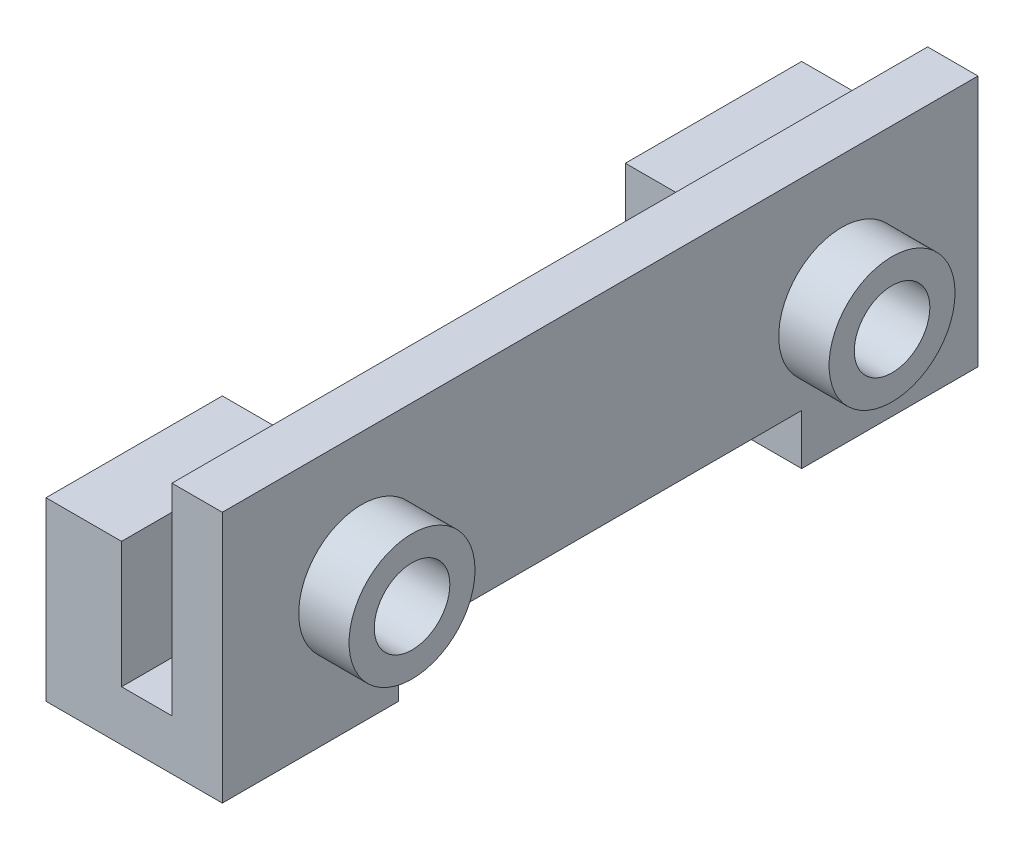
ISO-10303-21;
HEADER;
FILE_DESCRIPTION(('STEP AP214'),'2;1');
FILE_NAME('part.step','',(''),(''),'','','');
FILE_SCHEMA(('AUTOMOTIVE_DESIGN { 1 0 10303 214 1 1 1 1 }'));
ENDSEC;
DATA;
#1=APPLICATION_CONTEXT('core data for automotive mechanical design processes');
#2=APPLICATION_PROTOCOL_DEFINITION('international standard','automotive_design',2000,#1);
#3=PRODUCT_CONTEXT('',#1,'mechanical');
#4=PRODUCT('Part','Part','',(#3));
#5=PRODUCT_RELATED_PRODUCT_CATEGORY('part','',(#4));
#6=PRODUCT_DEFINITION_FORMATION('','',#4);
#7=PRODUCT_DEFINITION_CONTEXT('part definition',#1,'design');
#8=PRODUCT_DEFINITION('design','',#6,#7);
#9=PRODUCT_DEFINITION_SHAPE('','',#8);
#10=(LENGTH_UNIT() NAMED_UNIT(*) SI_UNIT(.MILLI.,.METRE.));
#11=(NAMED_UNIT(*) PLANE_ANGLE_UNIT() SI_UNIT($,.RADIAN.));
#12=(NAMED_UNIT(*) SI_UNIT($,.STERADIAN.) SOLID_ANGLE_UNIT());
#13=UNCERTAINTY_MEASURE_WITH_UNIT(LENGTH_MEASURE(1.E-05),#10,'distance_accuracy_value','');
#14=(GEOMETRIC_REPRESENTATION_CONTEXT(3) GLOBAL_UNCERTAINTY_ASSIGNED_CONTEXT((#13)) GLOBAL_UNIT_ASSIGNED_CONTEXT((#10,
#11,#12)) REPRESENTATION_CONTEXT('',''));
#15=CARTESIAN_POINT('',(0.,0.,0.));
#16=DIRECTION('',(0.,0.,1.));
#17=DIRECTION('',(1.,0.,0.));
#18=AXIS2_PLACEMENT_3D('',#15,#16,#17);
#19=CARTESIAN_POINT('',(-5.,-3.,-15.));
#20=DIRECTION('',(0.,-1.,0.));
#21=DIRECTION('',(0.,0.,-1.));
#22=AXIS2_PLACEMENT_3D('',#19,#20,#21);
#23=PLANE('',#22);
#24=DIRECTION('',(0.,0.,-1.));
#25=VECTOR('',#24,1.);
#26=CARTESIAN_POINT('',(-2.,-3.,-15.));
#27=LINE('',#26,#25);
#28=CARTESIAN_POINT('',(-2.,-3.,-8.));
#29=VERTEX_POINT('',#28);
#30=CARTESIAN_POINT('',(-2.,-3.,-15.));
#31=VERTEX_POINT('',#30);
#32=EDGE_CURVE('E183',#29,#31,#27,.T.);
#33=ORIENTED_EDGE('',*,*,#32,.F.);
#34=DIRECTION('',(1.,0.,0.));
#35=VECTOR('',#34,1.);
#36=CARTESIAN_POINT('',(-5.,-3.,-8.));
#37=LINE('',#36,#35);
#38=CARTESIAN_POINT('',(0.,-3.,-8.));
#39=VERTEX_POINT('',#38);
#40=EDGE_CURVE('E213',#29,#39,#37,.T.);
#41=ORIENTED_EDGE('',*,*,#40,.T.);
#42=DIRECTION('',(0.,0.,-1.));
#43=VECTOR('',#42,1.);
#44=CARTESIAN_POINT('',(0.,-3.,-15.));
#45=LINE('',#44,#43);
#46=CARTESIAN_POINT('',(0.,-3.,-15.));
#47=VERTEX_POINT('',#46);
#48=EDGE_CURVE('E200',#39,#47,#45,.T.);
#49=ORIENTED_EDGE('',*,*,#48,.T.);
#50=DIRECTION('',(1.,0.,0.));
#51=VECTOR('',#50,1.);
#52=CARTESIAN_POINT('',(-5.,-3.,-15.));
#53=LINE('',#52,#51);
#54=EDGE_CURVE('E209',#31,#47,#53,.T.);
#55=ORIENTED_EDGE('',*,*,#54,.F.);
#56=EDGE_LOOP('',(#33,#41,#49,#55));
#57=FACE_BOUND('',#56,.T.);
#58=ADVANCED_FACE('F33',(#57),#23,.F.);
#59=CARTESIAN_POINT('',(0.,0.,0.));
#60=DIRECTION('',(1.,0.,0.));
#61=DIRECTION('',(0.,0.,-1.));
#62=AXIS2_PLACEMENT_3D('',#59,#60,#61);
#63=PLANE('',#62);
#64=CARTESIAN_POINT('',(0.,0.,-9.58862249274262));
#65=DIRECTION('',(1.,0.,0.));
#66=DIRECTION('',(0.,0.,-1.));
#67=AXIS2_PLACEMENT_3D('',#64,#65,#66);
#68=CIRCLE('',#67,1.5);
#69=CARTESIAN_POINT('',(0.,0.,-11.0886224927426));
#70=VERTEX_POINT('',#69);
#71=EDGE_CURVE('E237',#70,#70,#68,.T.);
#72=ORIENTED_EDGE('',*,*,#71,.T.);
#73=EDGE_LOOP('',(#72));
#74=FACE_BOUND('',#73,.T.);
#75=CARTESIAN_POINT('',(0.,0.,9.46784622414043));
#76=DIRECTION('',(1.,0.,0.));
#77=DIRECTION('',(0.,0.,-1.));
#78=AXIS2_PLACEMENT_3D('',#75,#76,#77);
#79=CIRCLE('',#78,1.5);
#80=CARTESIAN_POINT('',(0.,0.,7.96784622414043));
#81=VERTEX_POINT('',#80);
#82=EDGE_CURVE('E243',#81,#81,#79,.T.);
#83=ORIENTED_EDGE('',*,*,#82,.T.);
#84=EDGE_LOOP('',(#83));
#85=FACE_BOUND('',#84,.T.);
#86=DIRECTION('',(0.,0.,-1.));
#87=VECTOR('',#86,1.);
#88=CARTESIAN_POINT('',(0.,-3.,8.));
#89=LINE('',#88,#87);
#90=CARTESIAN_POINT('',(0.,-3.,8.));
#91=VERTEX_POINT('',#90);
#92=EDGE_CURVE('E230',#91,#39,#89,.T.);
#93=ORIENTED_EDGE('',*,*,#92,.F.);
#94=DIRECTION('',(0.,0.,1.));
#95=VECTOR('',#94,1.);
#96=CARTESIAN_POINT('',(0.,-3.,15.));
#97=LINE('',#96,#95);
#98=CARTESIAN_POINT('',(0.,-3.,15.));
#99=VERTEX_POINT('',#98);
#100=EDGE_CURVE('E152',#91,#99,#97,.T.);
#101=ORIENTED_EDGE('',*,*,#100,.T.);
#102=DIRECTION('',(0.,-1.,0.));
#103=VECTOR('',#102,1.);
#104=CARTESIAN_POINT('',(0.,5.,15.));
#105=LINE('',#104,#103);
#106=CARTESIAN_POINT('',(0.,5.,15.));
#107=VERTEX_POINT('',#106);
#108=EDGE_CURVE('E265',#107,#99,#105,.T.);
#109=ORIENTED_EDGE('',*,*,#108,.F.);
#110=DIRECTION('',(0.,0.,1.));
#111=VECTOR('',#110,1.);
#112=CARTESIAN_POINT('',(0.,5.,15.));
#113=LINE('',#112,#111);
#114=CARTESIAN_POINT('',(0.,5.,-15.));
#115=VERTEX_POINT('',#114);
#116=EDGE_CURVE('E275',#115,#107,#113,.T.);
#117=ORIENTED_EDGE('',*,*,#116,.F.);
#118=DIRECTION('',(0.,1.,0.));
#119=VECTOR('',#118,1.);
#120=CARTESIAN_POINT('',(0.,5.,-15.));
#121=LINE('',#120,#119);
#122=EDGE_CURVE('E258',#47,#115,#121,.T.);
#123=ORIENTED_EDGE('',*,*,#122,.F.);
#124=ORIENTED_EDGE('',*,*,#48,.F.);
#125=EDGE_LOOP('',(#93,#101,#109,#117,#123,#124));
#126=FACE_BOUND('',#125,.T.);
#127=ADVANCED_FACE('F288',(#74,#85,#126),#63,.F.);
#128=CARTESIAN_POINT('',(2.,-5.,15.));
#129=DIRECTION('',(0.,1.,0.));
#130=DIRECTION('',(0.,0.,1.));
#131=AXIS2_PLACEMENT_3D('',#128,#129,#130);
#132=PLANE('',#131);
#133=DIRECTION('',(-1.,0.,0.));
#134=VECTOR('',#133,1.);
#135=CARTESIAN_POINT('',(0.,-5.,-8.));
#136=LINE('',#135,#134);
#137=CARTESIAN_POINT('',(2.,-5.,-8.));
#138=VERTEX_POINT('',#137);
#139=CARTESIAN_POINT('',(-5.,-5.,-8.));
#140=VERTEX_POINT('',#139);
#141=EDGE_CURVE('E215',#138,#140,#136,.T.);
#142=ORIENTED_EDGE('',*,*,#141,.T.);
#143=DIRECTION('',(0.,0.,1.));
#144=VECTOR('',#143,1.);
#145=CARTESIAN_POINT('',(-5.,-5.,-15.));
#146=LINE('',#145,#144);
#147=CARTESIAN_POINT('',(-5.,-5.,-15.));
#148=VERTEX_POINT('',#147);
#149=EDGE_CURVE('E204',#148,#140,#146,.T.);
#150=ORIENTED_EDGE('',*,*,#149,.F.);
#151=DIRECTION('',(-1.,0.,0.));
#152=VECTOR('',#151,1.);
#153=CARTESIAN_POINT('',(2.,-5.,-15.));
#154=LINE('',#153,#152);
#155=CARTESIAN_POINT('',(2.,-5.,-15.));
#156=VERTEX_POINT('',#155);
#157=EDGE_CURVE('E273',#156,#148,#154,.T.);
#158=ORIENTED_EDGE('',*,*,#157,.F.);
#159=DIRECTION('',(0.,0.,-1.));
#160=VECTOR('',#159,1.);
#161=CARTESIAN_POINT('',(2.,-5.,15.));
#162=LINE('',#161,#160);
#163=EDGE_CURVE('E269',#138,#156,#162,.T.);
#164=ORIENTED_EDGE('',*,*,#163,.F.);
#165=EDGE_LOOP('',(#142,#150,#158,#164));
#166=FACE_BOUND('',#165,.T.);
#167=ADVANCED_FACE('F323',(#166),#132,.F.);
#168=CARTESIAN_POINT('',(2.,0.,0.));
#169=DIRECTION('',(1.,0.,0.));
#170=DIRECTION('',(0.,0.,-1.));
#171=AXIS2_PLACEMENT_3D('',#168,#169,#170);
#172=PLANE('',#171);
#173=CARTESIAN_POINT('',(2.,0.,9.46784622414043));
#174=DIRECTION('',(1.,0.,0.));
#175=DIRECTION('',(0.,0.,-1.));
#176=AXIS2_PLACEMENT_3D('',#173,#174,#175);
#177=CIRCLE('',#176,2.5);
#178=CARTESIAN_POINT('',(2.,0.,6.96784622414043));
#179=VERTEX_POINT('',#178);
#180=EDGE_CURVE('E249',#179,#179,#177,.T.);
#181=ORIENTED_EDGE('',*,*,#180,.F.);
#182=EDGE_LOOP('',(#181));
#183=FACE_BOUND('',#182,.T.);
#184=CARTESIAN_POINT('',(2.,0.,-9.58862249274262));
#185=DIRECTION('',(1.,0.,0.));
#186=DIRECTION('',(0.,0.,-1.));
#187=AXIS2_PLACEMENT_3D('',#184,#185,#186);
#188=CIRCLE('',#187,2.5);
#189=CARTESIAN_POINT('',(2.,0.,-12.0886224927426));
#190=VERTEX_POINT('',#189);
#191=EDGE_CURVE('E252',#190,#190,#188,.T.);
#192=ORIENTED_EDGE('',*,*,#191,.F.);
#193=EDGE_LOOP('',(#192));
#194=FACE_BOUND('',#193,.T.);
#195=DIRECTION('',(0.,0.,1.));
#196=VECTOR('',#195,1.);
#197=CARTESIAN_POINT('',(2.,-3.,8.));
#198=LINE('',#197,#196);
#199=CARTESIAN_POINT('',(2.,-3.,-8.));
#200=VERTEX_POINT('',#199);
#201=CARTESIAN_POINT('',(2.,-3.,8.));
#202=VERTEX_POINT('',#201);
#203=EDGE_CURVE('E224',#200,#202,#198,.T.);
#204=ORIENTED_EDGE('',*,*,#203,.F.);
#205=DIRECTION('',(0.,-1.,0.));
#206=VECTOR('',#205,1.);
#207=CARTESIAN_POINT('',(2.,-3.,-8.));
#208=LINE('',#207,#206);
#209=EDGE_CURVE('E219',#200,#138,#208,.T.);
#210=ORIENTED_EDGE('',*,*,#209,.T.);
#211=ORIENTED_EDGE('',*,*,#163,.T.);
#212=DIRECTION('',(0.,1.,0.));
#213=VECTOR('',#212,1.);
#214=CARTESIAN_POINT('',(2.,5.,-15.));
#215=LINE('',#214,#213);
#216=CARTESIAN_POINT('',(2.,5.,-15.));
#217=VERTEX_POINT('',#216);
#218=EDGE_CURVE('E261',#156,#217,#215,.T.);
#219=ORIENTED_EDGE('',*,*,#218,.T.);
#220=DIRECTION('',(0.,0.,1.));
#221=VECTOR('',#220,1.);
#222=CARTESIAN_POINT('',(2.,5.,15.));
#223=LINE('',#222,#221);
#224=CARTESIAN_POINT('',(2.,5.,15.));
#225=VERTEX_POINT('',#224);
#226=EDGE_CURVE('E264',#217,#225,#223,.T.);
#227=ORIENTED_EDGE('',*,*,#226,.T.);
#228=DIRECTION('',(0.,-1.,0.));
#229=VECTOR('',#228,1.);
#230=CARTESIAN_POINT('',(2.,5.,15.));
#231=LINE('',#230,#229);
#232=CARTESIAN_POINT('',(2.,-5.,15.));
#233=VERTEX_POINT('',#232);
#234=EDGE_CURVE('E267',#225,#233,#231,.T.);
#235=ORIENTED_EDGE('',*,*,#234,.T.);
#236=CARTESIAN_POINT('',(2.,-5.,8.));
#237=VERTEX_POINT('',#236);
#238=EDGE_CURVE('E270',#233,#237,#162,.T.);
#239=ORIENTED_EDGE('',*,*,#238,.T.);
#240=DIRECTION('',(0.,-1.,0.));
#241=VECTOR('',#240,1.);
#242=CARTESIAN_POINT('',(2.,-3.,8.));
#243=LINE('',#242,#241);
#244=EDGE_CURVE('E233',#202,#237,#243,.T.);
#245=ORIENTED_EDGE('',*,*,#244,.F.);
#246=EDGE_LOOP('',(#204,#210,#211,#219,#227,#235,#239,#245));
#247=FACE_BOUND('',#246,.T.);
#248=ADVANCED_FACE('F302',(#183,#194,#247),#172,.T.);
#249=CARTESIAN_POINT('',(2.,5.,-15.));
#250=DIRECTION('',(0.,0.,1.));
#251=DIRECTION('',(1.,0.,0.));
#252=AXIS2_PLACEMENT_3D('',#249,#250,#251);
#253=PLANE('',#252);
#254=ORIENTED_EDGE('',*,*,#157,.T.);
#255=DIRECTION('',(0.,-1.,0.));
#256=VECTOR('',#255,1.);
#257=CARTESIAN_POINT('',(-5.,-5.,-15.));
#258=LINE('',#257,#256);
#259=CARTESIAN_POINT('',(-5.,2.,-15.));
#260=VERTEX_POINT('',#259);
#261=EDGE_CURVE('E201',#260,#148,#258,.T.);
#262=ORIENTED_EDGE('',*,*,#261,.F.);
#263=DIRECTION('',(-1.,0.,0.));
#264=VECTOR('',#263,1.);
#265=CARTESIAN_POINT('',(-5.,2.,-15.));
#266=LINE('',#265,#264);
#267=CARTESIAN_POINT('',(-2.,2.,-15.));
#268=VERTEX_POINT('',#267);
#269=EDGE_CURVE('E191',#268,#260,#266,.T.);
#270=ORIENTED_EDGE('',*,*,#269,.F.);
#271=DIRECTION('',(0.,-1.,0.));
#272=VECTOR('',#271,1.);
#273=CARTESIAN_POINT('',(-2.,2.,-15.));
#274=LINE('',#273,#272);
#275=EDGE_CURVE('E194',#268,#31,#274,.T.);
#276=ORIENTED_EDGE('',*,*,#275,.T.);
#277=ORIENTED_EDGE('',*,*,#54,.T.);
#278=ORIENTED_EDGE('',*,*,#122,.T.);
#279=DIRECTION('',(-1.,0.,0.));
#280=VECTOR('',#279,1.);
#281=CARTESIAN_POINT('',(2.,5.,-15.));
#282=LINE('',#281,#280);
#283=EDGE_CURVE('E11',#217,#115,#282,.T.);
#284=ORIENTED_EDGE('',*,*,#283,.F.);
#285=ORIENTED_EDGE('',*,*,#218,.F.);
#286=EDGE_LOOP('',(#254,#262,#270,#276,#277,#278,#284,#285));
#287=FACE_BOUND('',#286,.T.);
#288=ADVANCED_FACE('F35',(#287),#253,.F.);
#289=CARTESIAN_POINT('',(2.,5.,15.));
#290=DIRECTION('',(0.,-1.,0.));
#291=DIRECTION('',(0.,0.,-1.));
#292=AXIS2_PLACEMENT_3D('',#289,#290,#291);
#293=PLANE('',#292);
#294=ORIENTED_EDGE('',*,*,#116,.T.);
#295=DIRECTION('',(-1.,0.,0.));
#296=VECTOR('',#295,1.);
#297=CARTESIAN_POINT('',(2.,5.,15.));
#298=LINE('',#297,#296);
#299=EDGE_CURVE('E41',#225,#107,#298,.T.);
#300=ORIENTED_EDGE('',*,*,#299,.F.);
#301=ORIENTED_EDGE('',*,*,#226,.F.);
#302=ORIENTED_EDGE('',*,*,#283,.T.);
#303=EDGE_LOOP('',(#294,#300,#301,#302));
#304=FACE_BOUND('',#303,.T.);
#305=ADVANCED_FACE('F305',(#304),#293,.F.);
#306=CARTESIAN_POINT('',(2.,5.,15.));
#307=DIRECTION('',(0.,0.,-1.));
#308=DIRECTION('',(-1.,0.,0.));
#309=AXIS2_PLACEMENT_3D('',#306,#307,#308);
#310=PLANE('',#309);
#311=ORIENTED_EDGE('',*,*,#108,.T.);
#312=DIRECTION('',(1.,0.,0.));
#313=VECTOR('',#312,1.);
#314=CARTESIAN_POINT('',(-5.,-3.,15.));
#315=LINE('',#314,#313);
#316=CARTESIAN_POINT('',(-2.,-3.,15.));
#317=VERTEX_POINT('',#316);
#318=EDGE_CURVE('E181',#317,#99,#315,.T.);
#319=ORIENTED_EDGE('',*,*,#318,.F.);
#320=DIRECTION('',(0.,-1.,0.));
#321=VECTOR('',#320,1.);
#322=CARTESIAN_POINT('',(-2.,2.,15.));
#323=LINE('',#322,#321);
#324=CARTESIAN_POINT('',(-2.,2.,15.));
#325=VERTEX_POINT('',#324);
#326=EDGE_CURVE('E166',#325,#317,#323,.T.);
#327=ORIENTED_EDGE('',*,*,#326,.F.);
#328=DIRECTION('',(-1.,0.,0.));
#329=VECTOR('',#328,1.);
#330=CARTESIAN_POINT('',(-5.,2.,15.));
#331=LINE('',#330,#329);
#332=CARTESIAN_POINT('',(-5.,2.,15.));
#333=VERTEX_POINT('',#332);
#334=EDGE_CURVE('E158',#325,#333,#331,.T.);
#335=ORIENTED_EDGE('',*,*,#334,.T.);
#336=DIRECTION('',(0.,-1.,0.));
#337=VECTOR('',#336,1.);
#338=CARTESIAN_POINT('',(-5.,-5.,15.));
#339=LINE('',#338,#337);
#340=CARTESIAN_POINT('',(-5.,-5.,15.));
#341=VERTEX_POINT('',#340);
#342=EDGE_CURVE('E140',#333,#341,#339,.T.);
#343=ORIENTED_EDGE('',*,*,#342,.T.);
#344=DIRECTION('',(-1.,0.,0.));
#345=VECTOR('',#344,1.);
#346=CARTESIAN_POINT('',(2.,-5.,15.));
#347=LINE('',#346,#345);
#348=EDGE_CURVE('E279',#233,#341,#347,.T.);
#349=ORIENTED_EDGE('',*,*,#348,.F.);
#350=ORIENTED_EDGE('',*,*,#234,.F.);
#351=ORIENTED_EDGE('',*,*,#299,.T.);
#352=EDGE_LOOP('',(#311,#319,#327,#335,#343,#349,#350,#351));
#353=FACE_BOUND('',#352,.T.);
#354=ADVANCED_FACE('F164',(#353),#310,.F.);
#355=ORIENTED_EDGE('',*,*,#348,.T.);
#356=DIRECTION('',(0.,0.,-1.));
#357=VECTOR('',#356,1.);
#358=CARTESIAN_POINT('',(-5.,-5.,15.));
#359=LINE('',#358,#357);
#360=CARTESIAN_POINT('',(-5.,-5.,8.));
#361=VERTEX_POINT('',#360);
#362=EDGE_CURVE('E147',#341,#361,#359,.T.);
#363=ORIENTED_EDGE('',*,*,#362,.T.);
#364=DIRECTION('',(-1.,0.,0.));
#365=VECTOR('',#364,1.);
#366=CARTESIAN_POINT('',(0.,-5.,8.));
#367=LINE('',#366,#365);
#368=EDGE_CURVE('E223',#237,#361,#367,.T.);
#369=ORIENTED_EDGE('',*,*,#368,.F.);
#370=ORIENTED_EDGE('',*,*,#238,.F.);
#371=EDGE_LOOP('',(#355,#363,#369,#370));
#372=FACE_BOUND('',#371,.T.);
#373=ADVANCED_FACE('F298',(#372),#132,.F.);
#374=CARTESIAN_POINT('',(4.,0.,-9.58862249274262));
#375=DIRECTION('',(-1.,0.,0.));
#376=DIRECTION('',(0.,0.,1.));
#377=AXIS2_PLACEMENT_3D('',#374,#375,#376);
#378=CYLINDRICAL_SURFACE('',#377,2.5);
#379=CARTESIAN_POINT('',(4.,0.,-9.58862249274262));
#380=DIRECTION('',(1.,0.,0.));
#381=DIRECTION('',(0.,0.,-1.));
#382=AXIS2_PLACEMENT_3D('',#379,#380,#381);
#383=CIRCLE('',#382,2.5);
#384=CARTESIAN_POINT('',(4.,0.,-12.0886224927426));
#385=VERTEX_POINT('',#384);
#386=EDGE_CURVE('E255',#385,#385,#383,.T.);
#387=ORIENTED_EDGE('',*,*,#386,.F.);
#388=EDGE_LOOP('',(#387));
#389=FACE_BOUND('',#388,.T.);
#390=ORIENTED_EDGE('',*,*,#191,.T.);
#391=EDGE_LOOP('',(#390));
#392=FACE_BOUND('',#391,.T.);
#393=ADVANCED_FACE('F374',(#389,#392),#378,.T.);
#394=CARTESIAN_POINT('',(4.,0.,-9.58862249274262));
#395=DIRECTION('',(1.,0.,0.));
#396=DIRECTION('',(0.,0.,-1.));
#397=AXIS2_PLACEMENT_3D('',#394,#395,#396);
#398=PLANE('',#397);
#399=CARTESIAN_POINT('',(4.,0.,-9.58862249274262));
#400=DIRECTION('',(1.,0.,0.));
#401=DIRECTION('',(0.,0.,-1.));
#402=AXIS2_PLACEMENT_3D('',#399,#400,#401);
#403=CIRCLE('',#402,1.5);
#404=CARTESIAN_POINT('',(4.,0.,-11.0886224927426));
#405=VERTEX_POINT('',#404);
#406=EDGE_CURVE('E236',#405,#405,#403,.T.);
#407=ORIENTED_EDGE('',*,*,#406,.F.);
#408=EDGE_LOOP('',(#407));
#409=FACE_BOUND('',#408,.T.);
#410=ORIENTED_EDGE('',*,*,#386,.T.);
#411=EDGE_LOOP('',(#410));
#412=FACE_BOUND('',#411,.T.);
#413=ADVANCED_FACE('F367',(#409,#412),#398,.T.);
#414=CARTESIAN_POINT('',(4.,0.,9.46784622414043));
#415=DIRECTION('',(-1.,0.,0.));
#416=DIRECTION('',(0.,0.,1.));
#417=AXIS2_PLACEMENT_3D('',#414,#415,#416);
#418=CYLINDRICAL_SURFACE('',#417,2.5);
#419=CARTESIAN_POINT('',(4.,0.,9.46784622414043));
#420=DIRECTION('',(1.,0.,0.));
#421=DIRECTION('',(0.,0.,-1.));
#422=AXIS2_PLACEMENT_3D('',#419,#420,#421);
#423=CIRCLE('',#422,2.5);
#424=CARTESIAN_POINT('',(4.,0.,6.96784622414043));
#425=VERTEX_POINT('',#424);
#426=EDGE_CURVE('E246',#425,#425,#423,.T.);
#427=ORIENTED_EDGE('',*,*,#426,.F.);
#428=EDGE_LOOP('',(#427));
#429=FACE_BOUND('',#428,.T.);
#430=ORIENTED_EDGE('',*,*,#180,.T.);
#431=EDGE_LOOP('',(#430));
#432=FACE_BOUND('',#431,.T.);
#433=ADVANCED_FACE('F364',(#429,#432),#418,.T.);
#434=CARTESIAN_POINT('',(4.,0.,9.46784622414043));
#435=DIRECTION('',(1.,0.,0.));
#436=DIRECTION('',(0.,0.,-1.));
#437=AXIS2_PLACEMENT_3D('',#434,#435,#436);
#438=PLANE('',#437);
#439=CARTESIAN_POINT('',(4.,0.,9.46784622414043));
#440=DIRECTION('',(1.,0.,0.));
#441=DIRECTION('',(0.,0.,-1.));
#442=AXIS2_PLACEMENT_3D('',#439,#440,#441);
#443=CIRCLE('',#442,1.5);
#444=CARTESIAN_POINT('',(4.,0.,7.96784622414043));
#445=VERTEX_POINT('',#444);
#446=EDGE_CURVE('E240',#445,#445,#443,.T.);
#447=ORIENTED_EDGE('',*,*,#446,.F.);
#448=EDGE_LOOP('',(#447));
#449=FACE_BOUND('',#448,.T.);
#450=ORIENTED_EDGE('',*,*,#426,.T.);
#451=EDGE_LOOP('',(#450));
#452=FACE_BOUND('',#451,.T.);
#453=ADVANCED_FACE('F362',(#449,#452),#438,.T.);
#454=CARTESIAN_POINT('',(0.,0.,9.46784622414043));
#455=DIRECTION('',(1.,0.,0.));
#456=DIRECTION('',(0.,0.,-1.));
#457=AXIS2_PLACEMENT_3D('',#454,#455,#456);
#458=CYLINDRICAL_SURFACE('',#457,1.5);
#459=ORIENTED_EDGE('',*,*,#82,.F.);
#460=EDGE_LOOP('',(#459));
#461=FACE_BOUND('',#460,.T.);
#462=ORIENTED_EDGE('',*,*,#446,.T.);
#463=EDGE_LOOP('',(#462));
#464=FACE_BOUND('',#463,.T.);
#465=ADVANCED_FACE('F358',(#461,#464),#458,.F.);
#466=CARTESIAN_POINT('',(0.,0.,-9.58862249274262));
#467=DIRECTION('',(1.,0.,0.));
#468=DIRECTION('',(0.,0.,-1.));
#469=AXIS2_PLACEMENT_3D('',#466,#467,#468);
#470=CYLINDRICAL_SURFACE('',#469,1.5);
#471=ORIENTED_EDGE('',*,*,#71,.F.);
#472=EDGE_LOOP('',(#471));
#473=FACE_BOUND('',#472,.T.);
#474=ORIENTED_EDGE('',*,*,#406,.T.);
#475=EDGE_LOOP('',(#474));
#476=FACE_BOUND('',#475,.T.);
#477=ADVANCED_FACE('F355',(#473,#476),#470,.F.);
#478=CARTESIAN_POINT('',(0.,-3.,8.));
#479=DIRECTION('',(0.,0.,1.));
#480=DIRECTION('',(1.,0.,0.));
#481=AXIS2_PLACEMENT_3D('',#478,#479,#480);
#482=PLANE('',#481);
#483=ORIENTED_EDGE('',*,*,#368,.T.);
#484=DIRECTION('',(0.,1.,0.));
#485=VECTOR('',#484,1.);
#486=CARTESIAN_POINT('',(-5.,-5.,8.));
#487=LINE('',#486,#485);
#488=CARTESIAN_POINT('',(-5.,2.,8.));
#489=VERTEX_POINT('',#488);
#490=EDGE_CURVE('E151',#361,#489,#487,.T.);
#491=ORIENTED_EDGE('',*,*,#490,.T.);
#492=DIRECTION('',(1.,0.,0.));
#493=VECTOR('',#492,1.);
#494=CARTESIAN_POINT('',(-5.,2.,8.));
#495=LINE('',#494,#493);
#496=CARTESIAN_POINT('',(-2.,2.,8.));
#497=VERTEX_POINT('',#496);
#498=EDGE_CURVE('E161',#489,#497,#495,.T.);
#499=ORIENTED_EDGE('',*,*,#498,.T.);
#500=DIRECTION('',(0.,-1.,0.));
#501=VECTOR('',#500,1.);
#502=CARTESIAN_POINT('',(-2.,2.,8.));
#503=LINE('',#502,#501);
#504=CARTESIAN_POINT('',(-2.,-3.,8.));
#505=VERTEX_POINT('',#504);
#506=EDGE_CURVE('E172',#497,#505,#503,.T.);
#507=ORIENTED_EDGE('',*,*,#506,.T.);
#508=DIRECTION('',(1.,0.,0.));
#509=VECTOR('',#508,1.);
#510=CARTESIAN_POINT('',(-5.,-3.,8.));
#511=LINE('',#510,#509);
#512=EDGE_CURVE('E53',#505,#91,#511,.T.);
#513=ORIENTED_EDGE('',*,*,#512,.T.);
#514=DIRECTION('',(-1.,0.,0.));
#515=VECTOR('',#514,1.);
#516=CARTESIAN_POINT('',(0.,-3.,8.));
#517=LINE('',#516,#515);
#518=EDGE_CURVE('E227',#202,#91,#517,.T.);
#519=ORIENTED_EDGE('',*,*,#518,.F.);
#520=ORIENTED_EDGE('',*,*,#244,.T.);
#521=EDGE_LOOP('',(#483,#491,#499,#507,#513,#519,#520));
#522=FACE_BOUND('',#521,.T.);
#523=ADVANCED_FACE('F295',(#522),#482,.F.);
#524=CARTESIAN_POINT('',(0.,-3.,0.));
#525=DIRECTION('',(0.,1.,0.));
#526=DIRECTION('',(0.,0.,1.));
#527=AXIS2_PLACEMENT_3D('',#524,#525,#526);
#528=PLANE('',#527);
#529=ORIENTED_EDGE('',*,*,#92,.T.);
#530=DIRECTION('',(-1.,0.,0.));
#531=VECTOR('',#530,1.);
#532=CARTESIAN_POINT('',(0.,-3.,-8.));
#533=LINE('',#532,#531);
#534=EDGE_CURVE('E216',#200,#39,#533,.T.);
#535=ORIENTED_EDGE('',*,*,#534,.F.);
#536=ORIENTED_EDGE('',*,*,#203,.T.);
#537=ORIENTED_EDGE('',*,*,#518,.T.);
#538=EDGE_LOOP('',(#529,#535,#536,#537));
#539=FACE_BOUND('',#538,.T.);
#540=ADVANCED_FACE('F319',(#539),#528,.F.);
#541=CARTESIAN_POINT('',(0.,-3.,-8.));
#542=DIRECTION('',(0.,0.,1.));
#543=DIRECTION('',(1.,0.,0.));
#544=AXIS2_PLACEMENT_3D('',#541,#542,#543);
#545=PLANE('',#544);
#546=ORIENTED_EDGE('',*,*,#141,.F.);
#547=ORIENTED_EDGE('',*,*,#209,.F.);
#548=ORIENTED_EDGE('',*,*,#534,.T.);
#549=ORIENTED_EDGE('',*,*,#40,.F.);
#550=DIRECTION('',(0.,-1.,0.));
#551=VECTOR('',#550,1.);
#552=CARTESIAN_POINT('',(-2.,2.,-8.));
#553=LINE('',#552,#551);
#554=CARTESIAN_POINT('',(-2.,2.,-8.));
#555=VERTEX_POINT('',#554);
#556=EDGE_CURVE('E198',#555,#29,#553,.T.);
#557=ORIENTED_EDGE('',*,*,#556,.F.);
#558=DIRECTION('',(1.,0.,0.));
#559=VECTOR('',#558,1.);
#560=CARTESIAN_POINT('',(-5.,2.,-8.));
#561=LINE('',#560,#559);
#562=CARTESIAN_POINT('',(-5.,2.,-8.));
#563=VERTEX_POINT('',#562);
#564=EDGE_CURVE('E187',#563,#555,#561,.T.);
#565=ORIENTED_EDGE('',*,*,#564,.F.);
#566=DIRECTION('',(0.,1.,0.));
#567=VECTOR('',#566,1.);
#568=CARTESIAN_POINT('',(-5.,-5.,-8.));
#569=LINE('',#568,#567);
#570=EDGE_CURVE('E207',#140,#563,#569,.T.);
#571=ORIENTED_EDGE('',*,*,#570,.F.);
#572=EDGE_LOOP('',(#546,#547,#548,#549,#557,#565,#571));
#573=FACE_BOUND('',#572,.T.);
#574=ADVANCED_FACE('F313',(#573),#545,.T.);
#575=CARTESIAN_POINT('',(-5.,0.,0.));
#576=DIRECTION('',(1.,0.,0.));
#577=DIRECTION('',(0.,0.,-1.));
#578=AXIS2_PLACEMENT_3D('',#575,#576,#577);
#579=PLANE('',#578);
#580=ORIENTED_EDGE('',*,*,#261,.T.);
#581=ORIENTED_EDGE('',*,*,#149,.T.);
#582=ORIENTED_EDGE('',*,*,#570,.T.);
#583=DIRECTION('',(0.,0.,1.));
#584=VECTOR('',#583,1.);
#585=CARTESIAN_POINT('',(-5.,2.,-15.));
#586=LINE('',#585,#584);
#587=EDGE_CURVE('E184',#260,#563,#586,.T.);
#588=ORIENTED_EDGE('',*,*,#587,.F.);
#589=EDGE_LOOP('',(#580,#581,#582,#588));
#590=FACE_BOUND('',#589,.T.);
#591=ADVANCED_FACE('F331',(#590),#579,.F.);
#592=CARTESIAN_POINT('',(-2.,2.,-15.));
#593=DIRECTION('',(-1.,0.,0.));
#594=DIRECTION('',(0.,0.,1.));
#595=AXIS2_PLACEMENT_3D('',#592,#593,#594);
#596=PLANE('',#595);
#597=ORIENTED_EDGE('',*,*,#32,.T.);
#598=ORIENTED_EDGE('',*,*,#275,.F.);
#599=DIRECTION('',(0.,0.,-1.));
#600=VECTOR('',#599,1.);
#601=CARTESIAN_POINT('',(-2.,2.,-15.));
#602=LINE('',#601,#600);
#603=EDGE_CURVE('E189',#555,#268,#602,.T.);
#604=ORIENTED_EDGE('',*,*,#603,.F.);
#605=ORIENTED_EDGE('',*,*,#556,.T.);
#606=EDGE_LOOP('',(#597,#598,#604,#605));
#607=FACE_BOUND('',#606,.T.);
#608=ADVANCED_FACE('F334',(#607),#596,.F.);
#609=CARTESIAN_POINT('',(0.,2.,0.));
#610=DIRECTION('',(0.,1.,0.));
#611=DIRECTION('',(0.,0.,1.));
#612=AXIS2_PLACEMENT_3D('',#609,#610,#611);
#613=PLANE('',#612);
#614=ORIENTED_EDGE('',*,*,#587,.T.);
#615=ORIENTED_EDGE('',*,*,#564,.T.);
#616=ORIENTED_EDGE('',*,*,#603,.T.);
#617=ORIENTED_EDGE('',*,*,#269,.T.);
#618=EDGE_LOOP('',(#614,#615,#616,#617));
#619=FACE_BOUND('',#618,.T.);
#620=ADVANCED_FACE('F329',(#619),#613,.T.);
#621=CARTESIAN_POINT('',(-5.,-3.,15.));
#622=DIRECTION('',(0.,1.,0.));
#623=DIRECTION('',(0.,0.,1.));
#624=AXIS2_PLACEMENT_3D('',#621,#622,#623);
#625=PLANE('',#624);
#626=DIRECTION('',(0.,0.,1.));
#627=VECTOR('',#626,1.);
#628=CARTESIAN_POINT('',(-2.,-3.,15.));
#629=LINE('',#628,#627);
#630=EDGE_CURVE('E48',#505,#317,#629,.T.);
#631=ORIENTED_EDGE('',*,*,#630,.T.);
#632=ORIENTED_EDGE('',*,*,#318,.T.);
#633=ORIENTED_EDGE('',*,*,#100,.F.);
#634=ORIENTED_EDGE('',*,*,#512,.F.);
#635=EDGE_LOOP('',(#631,#632,#633,#634));
#636=FACE_BOUND('',#635,.T.);
#637=ADVANCED_FACE('F291',(#636),#625,.T.);
#638=CARTESIAN_POINT('',(-5.,0.,0.));
#639=DIRECTION('',(1.,0.,0.));
#640=DIRECTION('',(0.,0.,1.));
#641=AXIS2_PLACEMENT_3D('',#638,#639,#640);
#642=PLANE('',#641);
#643=ORIENTED_EDGE('',*,*,#342,.F.);
#644=DIRECTION('',(0.,0.,-1.));
#645=VECTOR('',#644,1.);
#646=CARTESIAN_POINT('',(-5.,2.,15.));
#647=LINE('',#646,#645);
#648=EDGE_CURVE('E144',#333,#489,#647,.T.);
#649=ORIENTED_EDGE('',*,*,#648,.T.);
#650=ORIENTED_EDGE('',*,*,#490,.F.);
#651=ORIENTED_EDGE('',*,*,#362,.F.);
#652=EDGE_LOOP('',(#643,#649,#650,#651));
#653=FACE_BOUND('',#652,.T.);
#654=ADVANCED_FACE('F142',(#653),#642,.F.);
#655=CARTESIAN_POINT('',(-2.,2.,15.));
#656=DIRECTION('',(1.,0.,0.));
#657=DIRECTION('',(0.,0.,-1.));
#658=AXIS2_PLACEMENT_3D('',#655,#656,#657);
#659=PLANE('',#658);
#660=ORIENTED_EDGE('',*,*,#630,.F.);
#661=ORIENTED_EDGE('',*,*,#506,.F.);
#662=DIRECTION('',(0.,0.,1.));
#663=VECTOR('',#662,1.);
#664=CARTESIAN_POINT('',(-2.,2.,15.));
#665=LINE('',#664,#663);
#666=EDGE_CURVE('E167',#497,#325,#665,.T.);
#667=ORIENTED_EDGE('',*,*,#666,.T.);
#668=ORIENTED_EDGE('',*,*,#326,.T.);
#669=EDGE_LOOP('',(#660,#661,#667,#668));
#670=FACE_BOUND('',#669,.T.);
#671=ADVANCED_FACE('F293',(#670),#659,.T.);
#672=CARTESIAN_POINT('',(0.,2.,0.));
#673=DIRECTION('',(0.,1.,0.));
#674=DIRECTION('',(0.,0.,-1.));
#675=AXIS2_PLACEMENT_3D('',#672,#673,#674);
#676=PLANE('',#675);
#677=ORIENTED_EDGE('',*,*,#648,.F.);
#678=ORIENTED_EDGE('',*,*,#334,.F.);
#679=ORIENTED_EDGE('',*,*,#666,.F.);
#680=ORIENTED_EDGE('',*,*,#498,.F.);
#681=EDGE_LOOP('',(#677,#678,#679,#680));
#682=FACE_BOUND('',#681,.T.);
#683=ADVANCED_FACE('F156',(#682),#676,.T.);
#684=CLOSED_SHELL('',(#58,#127,#167,#248,#288,#305,#354,#373,#393,#413,#433,#453,#465,#477,#523,
#540,#574,#591,#608,#620,#637,#654,#671,#683));
#685=MANIFOLD_SOLID_BREP('B2',#684);
#686=ADVANCED_BREP_SHAPE_REPRESENTATION('',(#18,#685),#14);
#687=SHAPE_DEFINITION_REPRESENTATION(#9,#686);
ENDSEC;
END-ISO-10303-21;
